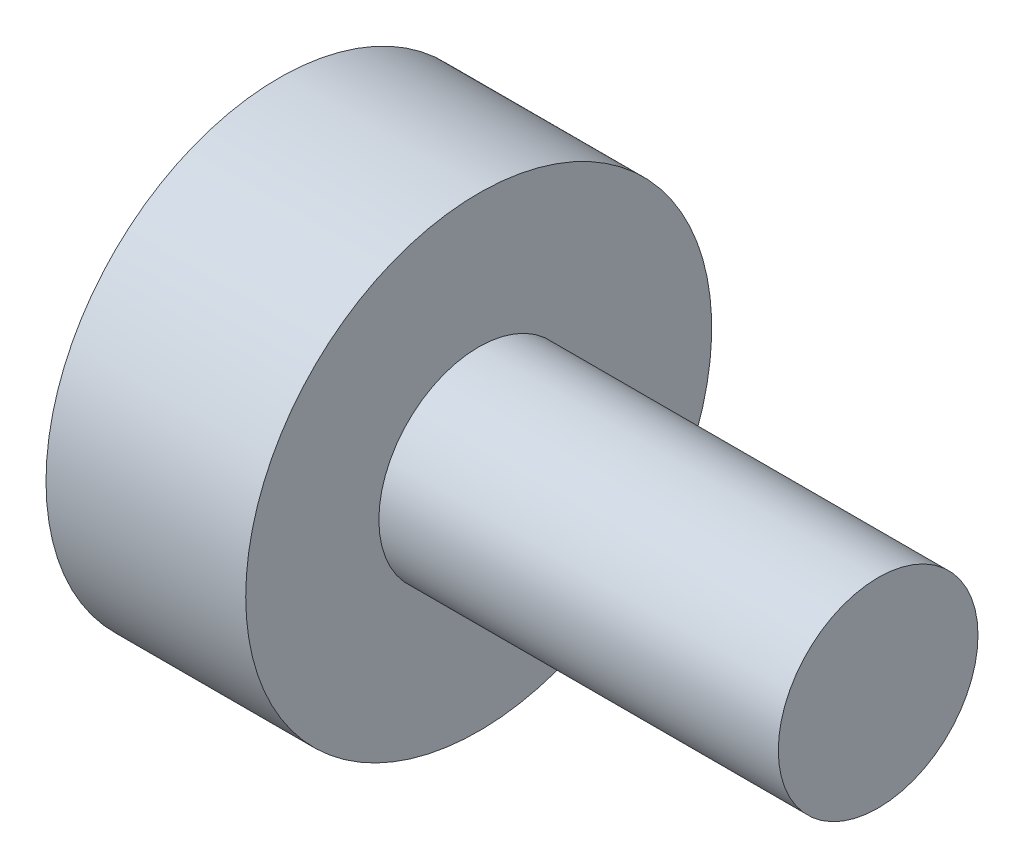
ISO-10303-21;
HEADER;
FILE_DESCRIPTION(('STEP AP214'),'2;1');
FILE_NAME('part.step','',(''),(''),'','','');
FILE_SCHEMA(('AUTOMOTIVE_DESIGN { 1 0 10303 214 1 1 1 1 }'));
ENDSEC;
DATA;
#1=APPLICATION_CONTEXT('core data for automotive mechanical design processes');
#2=APPLICATION_PROTOCOL_DEFINITION('international standard','automotive_design',2000,#1);
#3=PRODUCT_CONTEXT('',#1,'mechanical');
#4=PRODUCT('Part','Part','',(#3));
#5=PRODUCT_RELATED_PRODUCT_CATEGORY('part','',(#4));
#6=PRODUCT_DEFINITION_FORMATION('','',#4);
#7=PRODUCT_DEFINITION_CONTEXT('part definition',#1,'design');
#8=PRODUCT_DEFINITION('design','',#6,#7);
#9=PRODUCT_DEFINITION_SHAPE('','',#8);
#10=(LENGTH_UNIT() NAMED_UNIT(*) SI_UNIT(.MILLI.,.METRE.));
#11=(NAMED_UNIT(*) PLANE_ANGLE_UNIT() SI_UNIT($,.RADIAN.));
#12=(NAMED_UNIT(*) SI_UNIT($,.STERADIAN.) SOLID_ANGLE_UNIT());
#13=UNCERTAINTY_MEASURE_WITH_UNIT(LENGTH_MEASURE(1.E-05),#10,'distance_accuracy_value','');
#14=(GEOMETRIC_REPRESENTATION_CONTEXT(3) GLOBAL_UNCERTAINTY_ASSIGNED_CONTEXT((#13)) GLOBAL_UNIT_ASSIGNED_CONTEXT((#10,
#11,#12)) REPRESENTATION_CONTEXT('',''));
#15=CARTESIAN_POINT('',(0.,0.,0.));
#16=DIRECTION('',(0.,0.,1.));
#17=DIRECTION('',(1.,0.,0.));
#18=AXIS2_PLACEMENT_3D('',#15,#16,#17);
#19=CARTESIAN_POINT('',(0.,0.,0.));
#20=DIRECTION('',(1.,0.,0.));
#21=DIRECTION('',(0.,0.,-1.));
#22=AXIS2_PLACEMENT_3D('',#19,#20,#21);
#23=PLANE('',#22);
#24=CARTESIAN_POINT('',(0.,0.,0.));
#25=DIRECTION('',(1.,0.,0.));
#26=DIRECTION('',(0.,0.,-1.));
#27=AXIS2_PLACEMENT_3D('',#24,#25,#26);
#28=CIRCLE('',#27,9.);
#29=CARTESIAN_POINT('',(0.,0.,-9.));
#30=VERTEX_POINT('',#29);
#31=EDGE_CURVE('E68',#30,#30,#28,.T.);
#32=ORIENTED_EDGE('',*,*,#31,.T.);
#33=EDGE_LOOP('',(#32));
#34=FACE_BOUND('',#33,.T.);
#35=CARTESIAN_POINT('',(0.,0.,0.));
#36=DIRECTION('',(-1.,0.,0.));
#37=DIRECTION('',(0.,0.,1.));
#38=AXIS2_PLACEMENT_3D('',#35,#36,#37);
#39=CIRCLE('',#38,20.);
#40=CARTESIAN_POINT('',(0.,0.,20.));
#41=VERTEX_POINT('',#40);
#42=EDGE_CURVE('E10',#41,#41,#39,.T.);
#43=ORIENTED_EDGE('',*,*,#42,.T.);
#44=EDGE_LOOP('',(#43));
#45=FACE_BOUND('',#44,.T.);
#46=ADVANCED_FACE('F37',(#34,#45),#23,.F.);
#47=CARTESIAN_POINT('',(0.,0.,0.));
#48=DIRECTION('',(-1.,0.,0.));
#49=DIRECTION('',(0.,0.,1.));
#50=AXIS2_PLACEMENT_3D('',#47,#48,#49);
#51=CYLINDRICAL_SURFACE('',#50,20.);
#52=ORIENTED_EDGE('',*,*,#42,.F.);
#53=EDGE_LOOP('',(#52));
#54=FACE_BOUND('',#53,.T.);
#55=CARTESIAN_POINT('',(10.,0.,0.));
#56=DIRECTION('',(-1.,0.,0.));
#57=DIRECTION('',(0.,0.,1.));
#58=AXIS2_PLACEMENT_3D('',#55,#56,#57);
#59=CIRCLE('',#58,20.);
#60=CARTESIAN_POINT('',(10.,0.,20.));
#61=VERTEX_POINT('',#60);
#62=EDGE_CURVE('E43',#61,#61,#59,.T.);
#63=ORIENTED_EDGE('',*,*,#62,.T.);
#64=EDGE_LOOP('',(#63));
#65=FACE_BOUND('',#64,.T.);
#66=ADVANCED_FACE('F91',(#54,#65),#51,.T.);
#67=CARTESIAN_POINT('',(10.,20.,0.));
#68=DIRECTION('',(1.,0.,0.));
#69=DIRECTION('',(0.,0.,-1.));
#70=AXIS2_PLACEMENT_3D('',#67,#68,#69);
#71=PLANE('',#70);
#72=ORIENTED_EDGE('',*,*,#62,.F.);
#73=EDGE_LOOP('',(#72));
#74=FACE_BOUND('',#73,.T.);
#75=CARTESIAN_POINT('',(10.,0.,0.));
#76=DIRECTION('',(-1.,0.,0.));
#77=DIRECTION('',(0.,0.,1.));
#78=AXIS2_PLACEMENT_3D('',#75,#76,#77);
#79=CIRCLE('',#78,35.);
#80=CARTESIAN_POINT('',(10.,0.,35.));
#81=VERTEX_POINT('',#80);
#82=EDGE_CURVE('E47',#81,#81,#79,.T.);
#83=ORIENTED_EDGE('',*,*,#82,.T.);
#84=EDGE_LOOP('',(#83));
#85=FACE_BOUND('',#84,.T.);
#86=ADVANCED_FACE('F95',(#74,#85),#71,.F.);
#87=CARTESIAN_POINT('',(0.,0.,0.));
#88=DIRECTION('',(-1.,0.,0.));
#89=DIRECTION('',(0.,0.,1.));
#90=AXIS2_PLACEMENT_3D('',#87,#88,#89);
#91=CYLINDRICAL_SURFACE('',#90,35.);
#92=ORIENTED_EDGE('',*,*,#82,.F.);
#93=EDGE_LOOP('',(#92));
#94=FACE_BOUND('',#93,.T.);
#95=CARTESIAN_POINT('',(40.,0.,0.));
#96=DIRECTION('',(-1.,0.,0.));
#97=DIRECTION('',(0.,0.,1.));
#98=AXIS2_PLACEMENT_3D('',#95,#96,#97);
#99=CIRCLE('',#98,35.);
#100=CARTESIAN_POINT('',(40.,0.,35.));
#101=VERTEX_POINT('',#100);
#102=EDGE_CURVE('E51',#101,#101,#99,.T.);
#103=ORIENTED_EDGE('',*,*,#102,.T.);
#104=EDGE_LOOP('',(#103));
#105=FACE_BOUND('',#104,.T.);
#106=ADVANCED_FACE('F100',(#94,#105),#91,.T.);
#107=CARTESIAN_POINT('',(40.,35.,0.));
#108=DIRECTION('',(-1.,0.,0.));
#109=DIRECTION('',(0.,0.,1.));
#110=AXIS2_PLACEMENT_3D('',#107,#108,#109);
#111=PLANE('',#110);
#112=ORIENTED_EDGE('',*,*,#102,.F.);
#113=EDGE_LOOP('',(#112));
#114=FACE_BOUND('',#113,.T.);
#115=CARTESIAN_POINT('',(40.,0.,0.));
#116=DIRECTION('',(-1.,0.,0.));
#117=DIRECTION('',(0.,0.,1.));
#118=AXIS2_PLACEMENT_3D('',#115,#116,#117);
#119=CIRCLE('',#118,15.);
#120=CARTESIAN_POINT('',(40.,0.,15.));
#121=VERTEX_POINT('',#120);
#122=EDGE_CURVE('E56',#121,#121,#119,.T.);
#123=ORIENTED_EDGE('',*,*,#122,.T.);
#124=EDGE_LOOP('',(#123));
#125=FACE_BOUND('',#124,.T.);
#126=ADVANCED_FACE('F106',(#114,#125),#111,.F.);
#127=CARTESIAN_POINT('',(0.,0.,0.));
#128=DIRECTION('',(-1.,0.,0.));
#129=DIRECTION('',(0.,0.,1.));
#130=AXIS2_PLACEMENT_3D('',#127,#128,#129);
#131=CYLINDRICAL_SURFACE('',#130,15.);
#132=ORIENTED_EDGE('',*,*,#122,.F.);
#133=EDGE_LOOP('',(#132));
#134=FACE_BOUND('',#133,.T.);
#135=CARTESIAN_POINT('',(100.,0.,0.));
#136=DIRECTION('',(-1.,0.,0.));
#137=DIRECTION('',(0.,0.,1.));
#138=AXIS2_PLACEMENT_3D('',#135,#136,#137);
#139=CIRCLE('',#138,15.);
#140=CARTESIAN_POINT('',(100.,0.,15.));
#141=VERTEX_POINT('',#140);
#142=EDGE_CURVE('E59',#141,#141,#139,.T.);
#143=ORIENTED_EDGE('',*,*,#142,.T.);
#144=EDGE_LOOP('',(#143));
#145=FACE_BOUND('',#144,.T.);
#146=ADVANCED_FACE('F88',(#134,#145),#131,.T.);
#147=CARTESIAN_POINT('',(100.,0.,0.));
#148=DIRECTION('',(-1.,0.,0.));
#149=DIRECTION('',(0.,0.,1.));
#150=AXIS2_PLACEMENT_3D('',#147,#148,#149);
#151=PLANE('',#150);
#152=ORIENTED_EDGE('',*,*,#142,.F.);
#153=EDGE_LOOP('',(#152));
#154=FACE_BOUND('',#153,.T.);
#155=ADVANCED_FACE('F76',(#154),#151,.F.);
#156=CARTESIAN_POINT('',(0.,0.,0.));
#157=DIRECTION('',(-1.,0.,0.));
#158=DIRECTION('',(0.,0.,-1.));
#159=AXIS2_PLACEMENT_3D('',#156,#157,#158);
#160=CONICAL_SURFACE('',#159,9.,0.674740942223553);
#161=CARTESIAN_POINT('',(5.,0.,0.));
#162=DIRECTION('',(1.,0.,0.));
#163=DIRECTION('',(0.,0.,-1.));
#164=AXIS2_PLACEMENT_3D('',#161,#162,#163);
#165=CIRCLE('',#164,5.);
#166=CARTESIAN_POINT('',(5.,0.,-5.));
#167=VERTEX_POINT('',#166);
#168=EDGE_CURVE('E65',#167,#167,#165,.T.);
#169=ORIENTED_EDGE('',*,*,#168,.T.);
#170=EDGE_LOOP('',(#169));
#171=FACE_BOUND('',#170,.T.);
#172=ORIENTED_EDGE('',*,*,#31,.F.);
#173=EDGE_LOOP('',(#172));
#174=FACE_BOUND('',#173,.T.);
#175=ADVANCED_FACE('F73',(#171,#174),#160,.F.);
#176=CARTESIAN_POINT('',(20.,0.,0.));
#177=DIRECTION('',(1.,0.,0.));
#178=DIRECTION('',(0.,0.,-1.));
#179=AXIS2_PLACEMENT_3D('',#176,#177,#178);
#180=PLANE('',#179);
#181=CARTESIAN_POINT('',(20.,0.,0.));
#182=DIRECTION('',(1.,0.,0.));
#183=DIRECTION('',(0.,0.,-1.));
#184=AXIS2_PLACEMENT_3D('',#181,#182,#183);
#185=CIRCLE('',#184,5.);
#186=CARTESIAN_POINT('',(20.,0.,-5.));
#187=VERTEX_POINT('',#186);
#188=EDGE_CURVE('E62',#187,#187,#185,.T.);
#189=ORIENTED_EDGE('',*,*,#188,.F.);
#190=EDGE_LOOP('',(#189));
#191=FACE_BOUND('',#190,.T.);
#192=ADVANCED_FACE('F75',(#191),#180,.F.);
#193=CARTESIAN_POINT('',(20.,0.,0.));
#194=DIRECTION('',(-1.,0.,0.));
#195=DIRECTION('',(0.,0.,1.));
#196=AXIS2_PLACEMENT_3D('',#193,#194,#195);
#197=CYLINDRICAL_SURFACE('',#196,5.);
#198=ORIENTED_EDGE('',*,*,#168,.F.);
#199=EDGE_LOOP('',(#198));
#200=FACE_BOUND('',#199,.T.);
#201=ORIENTED_EDGE('',*,*,#188,.T.);
#202=EDGE_LOOP('',(#201));
#203=FACE_BOUND('',#202,.T.);
#204=ADVANCED_FACE('F84',(#200,#203),#197,.F.);
#205=CLOSED_SHELL('',(#46,#66,#86,#106,#126,#146,#155,#175,#192,#204));
#206=MANIFOLD_SOLID_BREP('B2',#205);
#207=ADVANCED_BREP_SHAPE_REPRESENTATION('',(#18,#206),#14);
#208=SHAPE_DEFINITION_REPRESENTATION(#9,#207);
ENDSEC;
END-ISO-10303-21;
